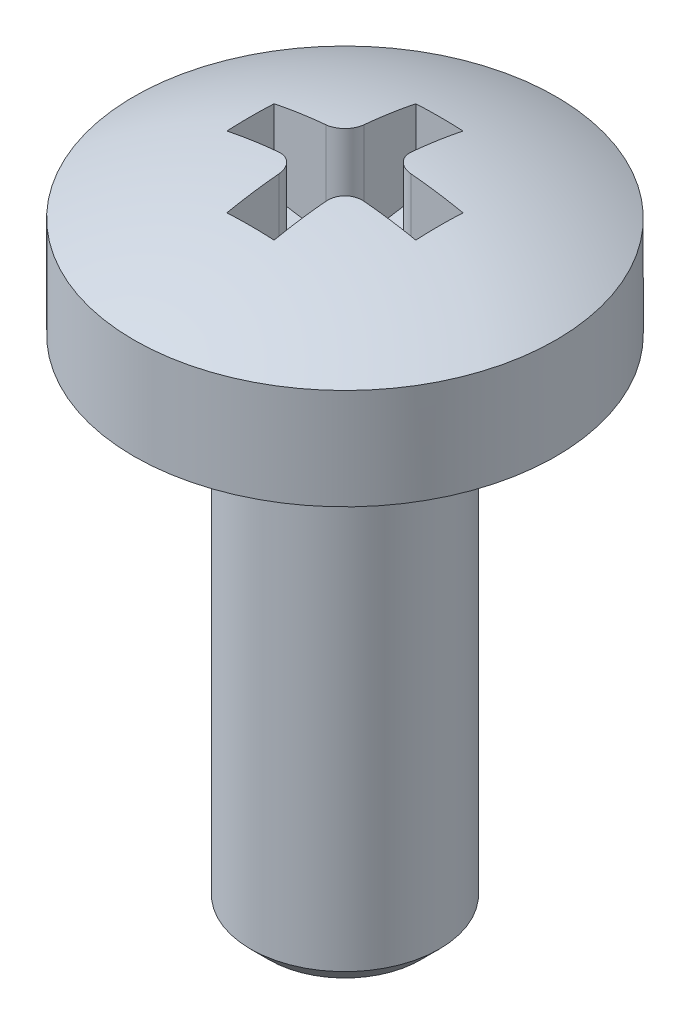
ISO-10303-21;
HEADER;
FILE_DESCRIPTION(('STEP AP214'),'2;1');
FILE_NAME('part.step','',(''),(''),'','','');
FILE_SCHEMA(('AUTOMOTIVE_DESIGN { 1 0 10303 214 1 1 1 1 }'));
ENDSEC;
DATA;
#1=APPLICATION_CONTEXT('core data for automotive mechanical design processes');
#2=APPLICATION_PROTOCOL_DEFINITION('international standard','automotive_design',2000,#1);
#3=PRODUCT_CONTEXT('',#1,'mechanical');
#4=PRODUCT('Part','Part','',(#3));
#5=PRODUCT_RELATED_PRODUCT_CATEGORY('part','',(#4));
#6=PRODUCT_DEFINITION_FORMATION('','',#4);
#7=PRODUCT_DEFINITION_CONTEXT('part definition',#1,'design');
#8=PRODUCT_DEFINITION('design','',#6,#7);
#9=PRODUCT_DEFINITION_SHAPE('','',#8);
#10=(LENGTH_UNIT() NAMED_UNIT(*) SI_UNIT(.MILLI.,.METRE.));
#11=(NAMED_UNIT(*) PLANE_ANGLE_UNIT() SI_UNIT($,.RADIAN.));
#12=(NAMED_UNIT(*) SI_UNIT($,.STERADIAN.) SOLID_ANGLE_UNIT());
#13=UNCERTAINTY_MEASURE_WITH_UNIT(LENGTH_MEASURE(1.E-05),#10,'distance_accuracy_value','');
#14=(GEOMETRIC_REPRESENTATION_CONTEXT(3) GLOBAL_UNCERTAINTY_ASSIGNED_CONTEXT((#13)) GLOBAL_UNIT_ASSIGNED_CONTEXT((#10,
#11,#12)) REPRESENTATION_CONTEXT('',''));
#15=CARTESIAN_POINT('',(0.,0.,0.));
#16=DIRECTION('',(0.,0.,1.));
#17=DIRECTION('',(1.,0.,0.));
#18=AXIS2_PLACEMENT_3D('',#15,#16,#17);
#19=CARTESIAN_POINT('',(0.,-5.01406250000001,0.));
#20=DIRECTION('',(0.,1.,0.));
#21=DIRECTION('',(1.,0.,0.));
#22=AXIS2_PLACEMENT_3D('',#19,#20,#21);
#23=SPHERICAL_SURFACE('',#22,7.41406250000001);
#24=CARTESIAN_POINT('',(0.375,-5.01406250000001,0.));
#25=DIRECTION('',(1.,0.,0.));
#26=DIRECTION('',(0.,0.,-1.));
#27=AXIS2_PLACEMENT_3D('',#24,#25,#26);
#28=CIRCLE('',#27,7.40457275971453);
#29=CARTESIAN_POINT('',(0.375,2.23698554520741,-1.5));
#30=VERTEX_POINT('',#29);
#31=CARTESIAN_POINT('',(0.375,2.35967961333067,-0.675));
#32=VERTEX_POINT('',#31);
#33=EDGE_CURVE('E196',#30,#32,#28,.T.);
#34=ORIENTED_EDGE('',*,*,#33,.T.);
#35=CARTESIAN_POINT('',(0.375,2.35967961333067,-0.675));
#36=CARTESIAN_POINT('',(0.374985448737684,2.36121651162663,-0.658225318985723));
#37=CARTESIAN_POINT('',(0.376406173652611,2.36262244801135,-0.641440863121498));
#38=CARTESIAN_POINT('',(0.382024650443457,2.36513771515628,-0.608329835626822));
#39=CARTESIAN_POINT('',(0.38622085767909,2.36624721041308,-0.592003014573896));
#40=CARTESIAN_POINT('',(0.397300635484306,2.36813732470414,-0.560254470482996));
#41=CARTESIAN_POINT('',(0.404185986366176,2.3689177251522,-0.544833354852065));
#42=CARTESIAN_POINT('',(0.420447745702151,2.37012589432307,-0.51535587131694));
#43=CARTESIAN_POINT('',(0.429823497039336,2.37055375594478,-0.501299144739112));
#44=CARTESIAN_POINT('',(0.45075479909411,2.37104328596649,-0.475012122203495));
#45=CARTESIAN_POINT('',(0.462300294783578,2.37110660254395,-0.462773849871419));
#46=CARTESIAN_POINT('',(0.487272192266538,2.3708695680863,-0.44039530197322));
#47=CARTESIAN_POINT('',(0.500698910491746,2.37056915580496,-0.430255380073096));
#48=CARTESIAN_POINT('',(0.529018787895926,2.36961443868963,-0.412379615394909));
#49=CARTESIAN_POINT('',(0.543909163871989,2.36896079528223,-0.404639321798304));
#50=CARTESIAN_POINT('',(0.574752563793523,2.3673189632613,-0.391751967993709));
#51=CARTESIAN_POINT('',(0.590705099903908,2.36633092738967,-0.386603726468988));
#52=CARTESIAN_POINT('',(0.618117361523144,2.36440750102671,-0.380218792603659));
#53=CARTESIAN_POINT('',(0.629420641493764,2.36355241306441,-0.378262173352228));
#54=CARTESIAN_POINT('',(0.65214973825016,2.36171137165102,-0.375652776766312));
#55=CARTESIAN_POINT('',(0.663575356982319,2.36072560683811,-0.37499814135454));
#56=CARTESIAN_POINT('',(0.675,2.35967961333067,-0.375));
#57=B_SPLINE_CURVE_WITH_KNOTS('',3,(#35,#36,#37,#38,#39,#40,#41,#42,#43,#44,#45,#46,#47,#48,#49,
#50,#51,#52,#53,#54,#55,#56),.UNSPECIFIED.,.F.,.F.,(4,2,2,2,2,2,2,2,2,2,4),(0.,
0.0504714064155058,0.100914747566651,0.15139154083357,0.201855028504468,0.252090180891864,
0.302333793268078,0.352483648650164,0.402610627712908,0.437049311049132,0.471438811145853),.UNSPECIFIED.);
#58=CARTESIAN_POINT('',(0.675,2.35967961333067,-0.375));
#59=VERTEX_POINT('',#58);
#60=EDGE_CURVE('E258',#32,#59,#57,.T.);
#61=ORIENTED_EDGE('',*,*,#60,.T.);
#62=CARTESIAN_POINT('',(0.,-5.01406250000001,-0.375));
#63=DIRECTION('',(0.,0.,-1.));
#64=DIRECTION('',(-1.,0.,0.));
#65=AXIS2_PLACEMENT_3D('',#62,#63,#64);
#66=CIRCLE('',#65,7.40457275971453);
#67=CARTESIAN_POINT('',(1.5,2.23698554520741,-0.375));
#68=VERTEX_POINT('',#67);
#69=EDGE_CURVE('E194',#59,#68,#66,.T.);
#70=ORIENTED_EDGE('',*,*,#69,.T.);
#71=CARTESIAN_POINT('',(1.5,-5.01406250000001,0.));
#72=DIRECTION('',(1.,0.,0.));
#73=DIRECTION('',(0.,0.,-1.));
#74=AXIS2_PLACEMENT_3D('',#71,#72,#73);
#75=CIRCLE('',#74,7.26073844411892);
#76=CARTESIAN_POINT('',(1.5,2.23698554520741,0.375));
#77=VERTEX_POINT('',#76);
#78=EDGE_CURVE('E171',#68,#77,#75,.T.);
#79=ORIENTED_EDGE('',*,*,#78,.T.);
#80=CARTESIAN_POINT('',(0.,-5.01406250000001,0.375));
#81=DIRECTION('',(0.,0.,1.));
#82=DIRECTION('',(1.,0.,0.));
#83=AXIS2_PLACEMENT_3D('',#80,#81,#82);
#84=CIRCLE('',#83,7.40457275971453);
#85=CARTESIAN_POINT('',(0.675,2.35967961333067,0.375));
#86=VERTEX_POINT('',#85);
#87=EDGE_CURVE('E220',#77,#86,#84,.T.);
#88=ORIENTED_EDGE('',*,*,#87,.T.);
#89=CARTESIAN_POINT('',(0.675,2.35967961333067,0.375));
#90=CARTESIAN_POINT('',(0.658225318985723,2.36121651162663,0.374985448737685));
#91=CARTESIAN_POINT('',(0.641440863121498,2.36262244801135,0.376406173652611));
#92=CARTESIAN_POINT('',(0.608329835626822,2.36513771515628,0.382024650443458));
#93=CARTESIAN_POINT('',(0.592003014573896,2.36624721041308,0.38622085767909));
#94=CARTESIAN_POINT('',(0.560254470482996,2.36813732470414,0.397300635484307));
#95=CARTESIAN_POINT('',(0.544833354852065,2.3689177251522,0.404185986366176));
#96=CARTESIAN_POINT('',(0.51535587131694,2.37012589432307,0.420447745702151));
#97=CARTESIAN_POINT('',(0.501299144739112,2.37055375594478,0.429823497039336));
#98=CARTESIAN_POINT('',(0.475012122203495,2.37104328596649,0.450754799094111));
#99=CARTESIAN_POINT('',(0.462773849871419,2.37110660254395,0.462300294783578));
#100=CARTESIAN_POINT('',(0.44039530197322,2.3708695680863,0.487272192266539));
#101=CARTESIAN_POINT('',(0.430255380073096,2.37056915580496,0.500698910491747));
#102=CARTESIAN_POINT('',(0.412379615394909,2.36961443868963,0.529018787895926));
#103=CARTESIAN_POINT('',(0.404639321798304,2.36896079528223,0.54390916387199));
#104=CARTESIAN_POINT('',(0.391751967993709,2.3673189632613,0.574752563793524));
#105=CARTESIAN_POINT('',(0.386603726468988,2.36633092738967,0.590705099903909));
#106=CARTESIAN_POINT('',(0.380218792603659,2.36440750102671,0.618117361523145));
#107=CARTESIAN_POINT('',(0.378262173352228,2.36355241306441,0.629420641493764));
#108=CARTESIAN_POINT('',(0.375652776766312,2.36171137165102,0.65214973825016));
#109=CARTESIAN_POINT('',(0.37499814135454,2.36072560683811,0.663575356982319));
#110=CARTESIAN_POINT('',(0.375,2.35967961333067,0.675));
#111=B_SPLINE_CURVE_WITH_KNOTS('',3,(#89,#90,#91,#92,#93,#94,#95,#96,#97,#98,#99,#100,#101,#102,
#103,#104,#105,#106,#107,#108,#109,#110),.UNSPECIFIED.,.F.,.F.,(4,2,2,2,2,2,2,2,2,2,4),(0.,
0.0504714064155059,0.100914747566651,0.151391540833571,0.201855028504468,0.252090180891864,
0.302333793268078,0.352483648650164,0.402610627712908,0.437049311049132,0.471438811145853),.UNSPECIFIED.);
#112=CARTESIAN_POINT('',(0.375,2.35967961333067,0.675));
#113=VERTEX_POINT('',#112);
#114=EDGE_CURVE('E253',#86,#113,#111,.T.);
#115=ORIENTED_EDGE('',*,*,#114,.T.);
#116=CARTESIAN_POINT('',(0.375,-5.01406250000001,0.));
#117=DIRECTION('',(1.,0.,0.));
#118=DIRECTION('',(0.,0.,-1.));
#119=AXIS2_PLACEMENT_3D('',#116,#117,#118);
#120=CIRCLE('',#119,7.40457275971453);
#121=CARTESIAN_POINT('',(0.375,2.23698554520741,1.5));
#122=VERTEX_POINT('',#121);
#123=EDGE_CURVE('E218',#113,#122,#120,.T.);
#124=ORIENTED_EDGE('',*,*,#123,.T.);
#125=CARTESIAN_POINT('',(0.,-5.01406250000001,1.5));
#126=DIRECTION('',(0.,0.,1.));
#127=DIRECTION('',(1.,0.,0.));
#128=AXIS2_PLACEMENT_3D('',#125,#126,#127);
#129=CIRCLE('',#128,7.26073844411892);
#130=CARTESIAN_POINT('',(-0.375,2.23698554520741,1.5));
#131=VERTEX_POINT('',#130);
#132=EDGE_CURVE('E215',#122,#131,#129,.T.);
#133=ORIENTED_EDGE('',*,*,#132,.T.);
#134=CARTESIAN_POINT('',(-0.375,-5.01406250000001,0.));
#135=DIRECTION('',(-1.,0.,0.));
#136=DIRECTION('',(0.,0.,1.));
#137=AXIS2_PLACEMENT_3D('',#134,#135,#136);
#138=CIRCLE('',#137,7.40457275971453);
#139=CARTESIAN_POINT('',(-0.375,2.35967961333067,0.675));
#140=VERTEX_POINT('',#139);
#141=EDGE_CURVE('E212',#131,#140,#138,.T.);
#142=ORIENTED_EDGE('',*,*,#141,.T.);
#143=CARTESIAN_POINT('',(-0.375,2.35967961333067,0.675));
#144=CARTESIAN_POINT('',(-0.374985448737685,2.36121651162663,0.658225318985723));
#145=CARTESIAN_POINT('',(-0.376406173652611,2.36262244801135,0.641440863121498));
#146=CARTESIAN_POINT('',(-0.382024650443458,2.36513771515628,0.608329835626822));
#147=CARTESIAN_POINT('',(-0.38622085767909,2.36624721041308,0.592003014573897));
#148=CARTESIAN_POINT('',(-0.397300635484307,2.36813732470414,0.560254470482997));
#149=CARTESIAN_POINT('',(-0.404185986366176,2.3689177251522,0.544833354852065));
#150=CARTESIAN_POINT('',(-0.420447745702151,2.37012589432307,0.515355871316941));
#151=CARTESIAN_POINT('',(-0.429823497039336,2.37055375594478,0.501299144739113));
#152=CARTESIAN_POINT('',(-0.450754799094111,2.37104328596649,0.475012122203495));
#153=CARTESIAN_POINT('',(-0.462300294783578,2.37110660254395,0.462773849871419));
#154=CARTESIAN_POINT('',(-0.487272192266539,2.3708695680863,0.44039530197322));
#155=CARTESIAN_POINT('',(-0.500698910491747,2.37056915580496,0.430255380073097));
#156=CARTESIAN_POINT('',(-0.529018787895926,2.36961443868963,0.412379615394909));
#157=CARTESIAN_POINT('',(-0.54390916387199,2.36896079528223,0.404639321798304));
#158=CARTESIAN_POINT('',(-0.574752563793524,2.3673189632613,0.39175196799371));
#159=CARTESIAN_POINT('',(-0.590705099903909,2.36633092738967,0.386603726468988));
#160=CARTESIAN_POINT('',(-0.618117361523144,2.36440750102671,0.38021879260366));
#161=CARTESIAN_POINT('',(-0.629420641493764,2.36355241306441,0.378262173352228));
#162=CARTESIAN_POINT('',(-0.65214973825016,2.36171137165102,0.375652776766313));
#163=CARTESIAN_POINT('',(-0.663575356982319,2.36072560683811,0.374998141354541));
#164=CARTESIAN_POINT('',(-0.675,2.35967961333067,0.375));
#165=B_SPLINE_CURVE_WITH_KNOTS('',3,(#143,#144,#145,#146,#147,#148,#149,#150,#151,#152,#153,
#154,#155,#156,#157,#158,#159,#160,#161,#162,#163,#164),.UNSPECIFIED.,.F.,.F.,(4,2,2,2,2,2,2,2,
2,2,4),(0.,0.0504714064155059,0.100914747566651,0.151391540833571,0.201855028504468,
0.252090180891864,0.302333793268078,0.352483648650164,0.402610627712908,0.437049311049132,
0.471438811145853),.UNSPECIFIED.);
#166=CARTESIAN_POINT('',(-0.675,2.35967961333067,0.375));
#167=VERTEX_POINT('',#166);
#168=EDGE_CURVE('E232',#140,#167,#165,.T.);
#169=ORIENTED_EDGE('',*,*,#168,.T.);
#170=CARTESIAN_POINT('',(0.,-5.01406250000001,0.375));
#171=DIRECTION('',(0.,0.,1.));
#172=DIRECTION('',(1.,0.,0.));
#173=AXIS2_PLACEMENT_3D('',#170,#171,#172);
#174=CIRCLE('',#173,7.40457275971453);
#175=CARTESIAN_POINT('',(-1.5,2.23698554520741,0.375));
#176=VERTEX_POINT('',#175);
#177=EDGE_CURVE('E210',#167,#176,#174,.T.);
#178=ORIENTED_EDGE('',*,*,#177,.T.);
#179=CARTESIAN_POINT('',(-1.5,-5.01406250000001,0.));
#180=DIRECTION('',(-1.,0.,0.));
#181=DIRECTION('',(0.,0.,1.));
#182=AXIS2_PLACEMENT_3D('',#179,#180,#181);
#183=CIRCLE('',#182,7.26073844411892);
#184=CARTESIAN_POINT('',(-1.5,2.23698554520741,-0.375));
#185=VERTEX_POINT('',#184);
#186=EDGE_CURVE('E207',#176,#185,#183,.T.);
#187=ORIENTED_EDGE('',*,*,#186,.T.);
#188=CARTESIAN_POINT('',(0.,-5.01406250000001,-0.375));
#189=DIRECTION('',(0.,0.,-1.));
#190=DIRECTION('',(-1.,0.,0.));
#191=AXIS2_PLACEMENT_3D('',#188,#189,#190);
#192=CIRCLE('',#191,7.40457275971453);
#193=CARTESIAN_POINT('',(-0.675,2.35967961333067,-0.375));
#194=VERTEX_POINT('',#193);
#195=EDGE_CURVE('E204',#185,#194,#192,.T.);
#196=ORIENTED_EDGE('',*,*,#195,.T.);
#197=CARTESIAN_POINT('',(-0.675,2.35967961333067,-0.375));
#198=CARTESIAN_POINT('',(-0.658225318985724,2.36121651162663,-0.374985448737684));
#199=CARTESIAN_POINT('',(-0.641440863121499,2.36262244801135,-0.376406173652611));
#200=CARTESIAN_POINT('',(-0.608329835626822,2.36513771515628,-0.382024650443457));
#201=CARTESIAN_POINT('',(-0.592003014573897,2.36624721041308,-0.38622085767909));
#202=CARTESIAN_POINT('',(-0.560254470482997,2.36813732470414,-0.397300635484306));
#203=CARTESIAN_POINT('',(-0.544833354852065,2.3689177251522,-0.404185986366176));
#204=CARTESIAN_POINT('',(-0.515355871316941,2.37012589432307,-0.420447745702151));
#205=CARTESIAN_POINT('',(-0.501299144739113,2.37055375594478,-0.429823497039336));
#206=CARTESIAN_POINT('',(-0.475012122203495,2.37104328596649,-0.45075479909411));
#207=CARTESIAN_POINT('',(-0.462773849871419,2.37110660254395,-0.462300294783578));
#208=CARTESIAN_POINT('',(-0.44039530197322,2.3708695680863,-0.487272192266538));
#209=CARTESIAN_POINT('',(-0.430255380073097,2.37056915580496,-0.500698910491746));
#210=CARTESIAN_POINT('',(-0.41237961539491,2.36961443868963,-0.529018787895926));
#211=CARTESIAN_POINT('',(-0.404639321798305,2.36896079528223,-0.543909163871989));
#212=CARTESIAN_POINT('',(-0.39175196799371,2.3673189632613,-0.574752563793523));
#213=CARTESIAN_POINT('',(-0.386603726468988,2.36633092738967,-0.590705099903908));
#214=CARTESIAN_POINT('',(-0.38021879260366,2.36440750102671,-0.618117361523144));
#215=CARTESIAN_POINT('',(-0.378262173352229,2.36355241306441,-0.629420641493764));
#216=CARTESIAN_POINT('',(-0.375652776766313,2.36171137165102,-0.65214973825016));
#217=CARTESIAN_POINT('',(-0.374998141354541,2.36072560683811,-0.663575356982319));
#218=CARTESIAN_POINT('',(-0.375,2.35967961333067,-0.675));
#219=B_SPLINE_CURVE_WITH_KNOTS('',3,(#197,#198,#199,#200,#201,#202,#203,#204,#205,#206,#207,
#208,#209,#210,#211,#212,#213,#214,#215,#216,#217,#218),.UNSPECIFIED.,.F.,.F.,(4,2,2,2,2,2,2,2,
2,2,4),(0.,0.0504714064155059,0.100914747566651,0.151391540833571,0.201855028504468,
0.252090180891864,0.302333793268078,0.352483648650164,0.402610627712908,0.437049311049132,
0.471438811145853),.UNSPECIFIED.);
#220=CARTESIAN_POINT('',(-0.375,2.35967961333067,-0.675));
#221=VERTEX_POINT('',#220);
#222=EDGE_CURVE('E226',#194,#221,#219,.T.);
#223=ORIENTED_EDGE('',*,*,#222,.T.);
#224=CARTESIAN_POINT('',(-0.375,-5.01406250000001,0.));
#225=DIRECTION('',(-1.,0.,0.));
#226=DIRECTION('',(0.,0.,1.));
#227=AXIS2_PLACEMENT_3D('',#224,#225,#226);
#228=CIRCLE('',#227,7.40457275971453);
#229=CARTESIAN_POINT('',(-0.375,2.23698554520741,-1.5));
#230=VERTEX_POINT('',#229);
#231=EDGE_CURVE('E202',#221,#230,#228,.T.);
#232=ORIENTED_EDGE('',*,*,#231,.T.);
#233=CARTESIAN_POINT('',(0.,-5.01406250000001,-1.5));
#234=DIRECTION('',(0.,0.,-1.));
#235=DIRECTION('',(-1.,0.,0.));
#236=AXIS2_PLACEMENT_3D('',#233,#234,#235);
#237=CIRCLE('',#236,7.26073844411892);
#238=EDGE_CURVE('E199',#230,#30,#237,.T.);
#239=ORIENTED_EDGE('',*,*,#238,.T.);
#240=EDGE_LOOP('',(#34,#61,#70,#79,#88,#115,#124,#133,#142,#169,#178,#187,#196,#223,#232,#239));
#241=FACE_BOUND('',#240,.T.);
#242=CARTESIAN_POINT('',(0.,1.6,0.));
#243=DIRECTION('',(0.,1.,0.));
#244=DIRECTION('',(0.,0.,1.));
#245=AXIS2_PLACEMENT_3D('',#242,#243,#244);
#246=CIRCLE('',#245,3.35);
#247=CARTESIAN_POINT('',(0.,1.6,3.35));
#248=VERTEX_POINT('',#247);
#249=EDGE_CURVE('E190',#248,#248,#246,.T.);
#250=ORIENTED_EDGE('',*,*,#249,.T.);
#251=EDGE_LOOP('',(#250));
#252=FACE_BOUND('',#251,.T.);
#253=ADVANCED_FACE('F38',(#241,#252),#23,.T.);
#254=CARTESIAN_POINT('',(0.,2.4,0.));
#255=DIRECTION('',(0.,1.,0.));
#256=DIRECTION('',(0.,0.,1.));
#257=AXIS2_PLACEMENT_3D('',#254,#255,#256);
#258=CYLINDRICAL_SURFACE('',#257,3.35);
#259=ORIENTED_EDGE('',*,*,#249,.F.);
#260=EDGE_LOOP('',(#259));
#261=FACE_BOUND('',#260,.T.);
#262=CARTESIAN_POINT('',(0.,0.,0.));
#263=DIRECTION('',(0.,1.,0.));
#264=DIRECTION('',(0.,0.,1.));
#265=AXIS2_PLACEMENT_3D('',#262,#263,#264);
#266=CIRCLE('',#265,3.35);
#267=CARTESIAN_POINT('',(0.,0.,3.35));
#268=VERTEX_POINT('',#267);
#269=EDGE_CURVE('E182',#268,#268,#266,.T.);
#270=ORIENTED_EDGE('',*,*,#269,.T.);
#271=EDGE_LOOP('',(#270));
#272=FACE_BOUND('',#271,.T.);
#273=ADVANCED_FACE('F244',(#261,#272),#258,.T.);
#274=CARTESIAN_POINT('',(3.35,0.,0.));
#275=DIRECTION('',(0.,1.,0.));
#276=DIRECTION('',(0.,0.,1.));
#277=AXIS2_PLACEMENT_3D('',#274,#275,#276);
#278=PLANE('',#277);
#279=CARTESIAN_POINT('',(0.,0.,0.));
#280=DIRECTION('',(0.,1.,0.));
#281=DIRECTION('',(0.,0.,1.));
#282=AXIS2_PLACEMENT_3D('',#279,#280,#281);
#283=CIRCLE('',#282,2.25);
#284=CARTESIAN_POINT('',(0.,0.,2.25));
#285=VERTEX_POINT('',#284);
#286=EDGE_CURVE('E330',#285,#285,#283,.T.);
#287=ORIENTED_EDGE('',*,*,#286,.T.);
#288=EDGE_LOOP('',(#287));
#289=FACE_BOUND('',#288,.T.);
#290=ORIENTED_EDGE('',*,*,#269,.F.);
#291=EDGE_LOOP('',(#290));
#292=FACE_BOUND('',#291,.T.);
#293=ADVANCED_FACE('F408',(#289,#292),#278,.F.);
#294=CARTESIAN_POINT('',(0.375,-8.001,0.375));
#295=DIRECTION('',(0.,0.,1.));
#296=DIRECTION('',(1.,0.,0.));
#297=AXIS2_PLACEMENT_3D('',#294,#295,#296);
#298=PLANE('',#297);
#299=CARTESIAN_POINT('',(0.,8.21406250000002,0.375));
#300=DIRECTION('',(0.,0.,1.));
#301=DIRECTION('',(1.,0.,0.));
#302=AXIS2_PLACEMENT_3D('',#299,#300,#301);
#303=CIRCLE('',#302,7.40457275971454);
#304=CARTESIAN_POINT('',(1.5,0.963014454792585,0.375));
#305=VERTEX_POINT('',#304);
#306=CARTESIAN_POINT('',(0.675,0.84032038666933,0.375));
#307=VERTEX_POINT('',#306);
#308=EDGE_CURVE('E177',#305,#307,#303,.F.);
#309=ORIENTED_EDGE('',*,*,#308,.T.);
#310=DIRECTION('',(0.,1.,0.));
#311=VECTOR('',#310,1.);
#312=CARTESIAN_POINT('',(0.675,-8.001,0.375));
#313=LINE('',#312,#311);
#314=EDGE_CURVE('E389',#307,#86,#313,.T.);
#315=ORIENTED_EDGE('',*,*,#314,.T.);
#316=ORIENTED_EDGE('',*,*,#87,.F.);
#317=DIRECTION('',(0.,1.,0.));
#318=VECTOR('',#317,1.);
#319=CARTESIAN_POINT('',(1.5,-8.001,0.375));
#320=LINE('',#319,#318);
#321=EDGE_CURVE('E173',#305,#77,#320,.T.);
#322=ORIENTED_EDGE('',*,*,#321,.F.);
#323=EDGE_LOOP('',(#309,#315,#316,#322));
#324=FACE_BOUND('',#323,.T.);
#325=ADVANCED_FACE('F406',(#324),#298,.F.);
#326=CARTESIAN_POINT('',(0.375,-8.001,0.375));
#327=DIRECTION('',(1.,0.,0.));
#328=DIRECTION('',(0.,0.,-1.));
#329=AXIS2_PLACEMENT_3D('',#326,#327,#328);
#330=PLANE('',#329);
#331=ORIENTED_EDGE('',*,*,#123,.F.);
#332=DIRECTION('',(0.,1.,0.));
#333=VECTOR('',#332,1.);
#334=CARTESIAN_POINT('',(0.375,-8.001,0.675));
#335=LINE('',#334,#333);
#336=CARTESIAN_POINT('',(0.375,0.84032038666933,0.675));
#337=VERTEX_POINT('',#336);
#338=EDGE_CURVE('E387',#113,#337,#335,.F.);
#339=ORIENTED_EDGE('',*,*,#338,.T.);
#340=CARTESIAN_POINT('',(0.375,8.21406250000002,0.));
#341=DIRECTION('',(1.,0.,0.));
#342=DIRECTION('',(0.,0.,-1.));
#343=AXIS2_PLACEMENT_3D('',#340,#341,#342);
#344=CIRCLE('',#343,7.40457275971454);
#345=CARTESIAN_POINT('',(0.375,0.963014454792585,1.5));
#346=VERTEX_POINT('',#345);
#347=EDGE_CURVE('E184',#337,#346,#344,.F.);
#348=ORIENTED_EDGE('',*,*,#347,.T.);
#349=DIRECTION('',(0.,1.,0.));
#350=VECTOR('',#349,1.);
#351=CARTESIAN_POINT('',(0.375,-8.001,1.5));
#352=LINE('',#351,#350);
#353=EDGE_CURVE('E163',#346,#122,#352,.T.);
#354=ORIENTED_EDGE('',*,*,#353,.T.);
#355=EDGE_LOOP('',(#331,#339,#348,#354));
#356=FACE_BOUND('',#355,.T.);
#357=ADVANCED_FACE('F295',(#356),#330,.F.);
#358=CARTESIAN_POINT('',(-0.375,-8.001,1.5));
#359=DIRECTION('',(0.,0.,1.));
#360=DIRECTION('',(1.,0.,0.));
#361=AXIS2_PLACEMENT_3D('',#358,#359,#360);
#362=PLANE('',#361);
#363=ORIENTED_EDGE('',*,*,#353,.F.);
#364=CARTESIAN_POINT('',(0.,8.21406250000002,1.5));
#365=DIRECTION('',(0.,0.,1.));
#366=DIRECTION('',(1.,0.,0.));
#367=AXIS2_PLACEMENT_3D('',#364,#365,#366);
#368=CIRCLE('',#367,7.26073844411893);
#369=CARTESIAN_POINT('',(-0.375,0.963014454792586,1.5));
#370=VERTEX_POINT('',#369);
#371=EDGE_CURVE('E349',#346,#370,#368,.F.);
#372=ORIENTED_EDGE('',*,*,#371,.T.);
#373=DIRECTION('',(0.,1.,0.));
#374=VECTOR('',#373,1.);
#375=CARTESIAN_POINT('',(-0.375,-8.001,1.5));
#376=LINE('',#375,#374);
#377=EDGE_CURVE('E354',#370,#131,#376,.T.);
#378=ORIENTED_EDGE('',*,*,#377,.T.);
#379=ORIENTED_EDGE('',*,*,#132,.F.);
#380=EDGE_LOOP('',(#363,#372,#378,#379));
#381=FACE_BOUND('',#380,.T.);
#382=ADVANCED_FACE('F447',(#381),#362,.F.);
#383=CARTESIAN_POINT('',(-0.375,-8.001,0.375));
#384=DIRECTION('',(-1.,0.,0.));
#385=DIRECTION('',(0.,0.,1.));
#386=AXIS2_PLACEMENT_3D('',#383,#384,#385);
#387=PLANE('',#386);
#388=CARTESIAN_POINT('',(-0.375,8.21406250000002,0.));
#389=DIRECTION('',(-1.,0.,0.));
#390=DIRECTION('',(0.,0.,1.));
#391=AXIS2_PLACEMENT_3D('',#388,#389,#390);
#392=CIRCLE('',#391,7.40457275971454);
#393=CARTESIAN_POINT('',(-0.375,0.84032038666933,0.675));
#394=VERTEX_POINT('',#393);
#395=EDGE_CURVE('E346',#370,#394,#392,.F.);
#396=ORIENTED_EDGE('',*,*,#395,.T.);
#397=DIRECTION('',(0.,1.,0.));
#398=VECTOR('',#397,1.);
#399=CARTESIAN_POINT('',(-0.375,-8.001,0.675));
#400=LINE('',#399,#398);
#401=EDGE_CURVE('E384',#394,#140,#400,.T.);
#402=ORIENTED_EDGE('',*,*,#401,.T.);
#403=ORIENTED_EDGE('',*,*,#141,.F.);
#404=ORIENTED_EDGE('',*,*,#377,.F.);
#405=EDGE_LOOP('',(#396,#402,#403,#404));
#406=FACE_BOUND('',#405,.T.);
#407=ADVANCED_FACE('F454',(#406),#387,.F.);
#408=CARTESIAN_POINT('',(-1.5,-8.001,0.375));
#409=DIRECTION('',(0.,0.,1.));
#410=DIRECTION('',(1.,0.,0.));
#411=AXIS2_PLACEMENT_3D('',#408,#409,#410);
#412=PLANE('',#411);
#413=ORIENTED_EDGE('',*,*,#177,.F.);
#414=DIRECTION('',(0.,1.,0.));
#415=VECTOR('',#414,1.);
#416=CARTESIAN_POINT('',(-0.675,-8.001,0.375));
#417=LINE('',#416,#415);
#418=CARTESIAN_POINT('',(-0.675,0.84032038666933,0.375));
#419=VERTEX_POINT('',#418);
#420=EDGE_CURVE('E380',#167,#419,#417,.F.);
#421=ORIENTED_EDGE('',*,*,#420,.T.);
#422=CARTESIAN_POINT('',(0.,8.21406250000002,0.375));
#423=DIRECTION('',(0.,0.,1.));
#424=DIRECTION('',(1.,0.,0.));
#425=AXIS2_PLACEMENT_3D('',#422,#423,#424);
#426=CIRCLE('',#425,7.40457275971454);
#427=CARTESIAN_POINT('',(-1.5,0.963014454792585,0.375));
#428=VERTEX_POINT('',#427);
#429=EDGE_CURVE('E344',#419,#428,#426,.F.);
#430=ORIENTED_EDGE('',*,*,#429,.T.);
#431=DIRECTION('',(0.,1.,0.));
#432=VECTOR('',#431,1.);
#433=CARTESIAN_POINT('',(-1.5,-8.001,0.375));
#434=LINE('',#433,#432);
#435=EDGE_CURVE('E357',#428,#176,#434,.T.);
#436=ORIENTED_EDGE('',*,*,#435,.T.);
#437=EDGE_LOOP('',(#413,#421,#430,#436));
#438=FACE_BOUND('',#437,.T.);
#439=ADVANCED_FACE('F459',(#438),#412,.F.);
#440=CARTESIAN_POINT('',(-1.5,-8.001,-0.375));
#441=DIRECTION('',(-1.,0.,0.));
#442=DIRECTION('',(0.,0.,1.));
#443=AXIS2_PLACEMENT_3D('',#440,#441,#442);
#444=PLANE('',#443);
#445=ORIENTED_EDGE('',*,*,#435,.F.);
#446=CARTESIAN_POINT('',(-1.5,8.21406250000002,0.));
#447=DIRECTION('',(-1.,0.,0.));
#448=DIRECTION('',(0.,0.,1.));
#449=AXIS2_PLACEMENT_3D('',#446,#447,#448);
#450=CIRCLE('',#449,7.26073844411893);
#451=CARTESIAN_POINT('',(-1.5,0.963014454792586,-0.375));
#452=VERTEX_POINT('',#451);
#453=EDGE_CURVE('E342',#428,#452,#450,.F.);
#454=ORIENTED_EDGE('',*,*,#453,.T.);
#455=DIRECTION('',(0.,1.,0.));
#456=VECTOR('',#455,1.);
#457=CARTESIAN_POINT('',(-1.5,-8.001,-0.375));
#458=LINE('',#457,#456);
#459=EDGE_CURVE('E360',#452,#185,#458,.T.);
#460=ORIENTED_EDGE('',*,*,#459,.T.);
#461=ORIENTED_EDGE('',*,*,#186,.F.);
#462=EDGE_LOOP('',(#445,#454,#460,#461));
#463=FACE_BOUND('',#462,.T.);
#464=ADVANCED_FACE('F469',(#463),#444,.F.);
#465=CARTESIAN_POINT('',(-1.5,-8.001,-0.375));
#466=DIRECTION('',(0.,0.,-1.));
#467=DIRECTION('',(-1.,0.,0.));
#468=AXIS2_PLACEMENT_3D('',#465,#466,#467);
#469=PLANE('',#468);
#470=CARTESIAN_POINT('',(0.,8.21406250000002,-0.375));
#471=DIRECTION('',(0.,0.,-1.));
#472=DIRECTION('',(-1.,0.,0.));
#473=AXIS2_PLACEMENT_3D('',#470,#471,#472);
#474=CIRCLE('',#473,7.40457275971454);
#475=CARTESIAN_POINT('',(-0.675,0.84032038666933,-0.375));
#476=VERTEX_POINT('',#475);
#477=EDGE_CURVE('E340',#452,#476,#474,.F.);
#478=ORIENTED_EDGE('',*,*,#477,.T.);
#479=DIRECTION('',(0.,1.,0.));
#480=VECTOR('',#479,1.);
#481=CARTESIAN_POINT('',(-0.675,-8.001,-0.375));
#482=LINE('',#481,#480);
#483=EDGE_CURVE('E379',#476,#194,#482,.T.);
#484=ORIENTED_EDGE('',*,*,#483,.T.);
#485=ORIENTED_EDGE('',*,*,#195,.F.);
#486=ORIENTED_EDGE('',*,*,#459,.F.);
#487=EDGE_LOOP('',(#478,#484,#485,#486));
#488=FACE_BOUND('',#487,.T.);
#489=ADVANCED_FACE('F477',(#488),#469,.F.);
#490=CARTESIAN_POINT('',(-0.375,-8.001,-1.5));
#491=DIRECTION('',(-1.,0.,0.));
#492=DIRECTION('',(0.,0.,1.));
#493=AXIS2_PLACEMENT_3D('',#490,#491,#492);
#494=PLANE('',#493);
#495=ORIENTED_EDGE('',*,*,#231,.F.);
#496=DIRECTION('',(0.,1.,0.));
#497=VECTOR('',#496,1.);
#498=CARTESIAN_POINT('',(-0.375,-8.001,-0.675));
#499=LINE('',#498,#497);
#500=CARTESIAN_POINT('',(-0.375,0.84032038666933,-0.675));
#501=VERTEX_POINT('',#500);
#502=EDGE_CURVE('E53',#221,#501,#499,.F.);
#503=ORIENTED_EDGE('',*,*,#502,.T.);
#504=CARTESIAN_POINT('',(-0.375,8.21406250000002,0.));
#505=DIRECTION('',(-1.,0.,0.));
#506=DIRECTION('',(0.,0.,1.));
#507=AXIS2_PLACEMENT_3D('',#504,#505,#506);
#508=CIRCLE('',#507,7.40457275971454);
#509=CARTESIAN_POINT('',(-0.375,0.963014454792585,-1.5));
#510=VERTEX_POINT('',#509);
#511=EDGE_CURVE('E338',#501,#510,#508,.F.);
#512=ORIENTED_EDGE('',*,*,#511,.T.);
#513=DIRECTION('',(0.,1.,0.));
#514=VECTOR('',#513,1.);
#515=CARTESIAN_POINT('',(-0.375,-8.001,-1.5));
#516=LINE('',#515,#514);
#517=EDGE_CURVE('E363',#510,#230,#516,.T.);
#518=ORIENTED_EDGE('',*,*,#517,.T.);
#519=EDGE_LOOP('',(#495,#503,#512,#518));
#520=FACE_BOUND('',#519,.T.);
#521=ADVANCED_FACE('F376',(#520),#494,.F.);
#522=CARTESIAN_POINT('',(-0.375,-8.001,-1.5));
#523=DIRECTION('',(0.,0.,-1.));
#524=DIRECTION('',(-1.,0.,0.));
#525=AXIS2_PLACEMENT_3D('',#522,#523,#524);
#526=PLANE('',#525);
#527=ORIENTED_EDGE('',*,*,#517,.F.);
#528=CARTESIAN_POINT('',(0.,8.21406250000002,-1.5));
#529=DIRECTION('',(0.,0.,-1.));
#530=DIRECTION('',(-1.,0.,0.));
#531=AXIS2_PLACEMENT_3D('',#528,#529,#530);
#532=CIRCLE('',#531,7.26073844411893);
#533=CARTESIAN_POINT('',(0.375,0.963014454792586,-1.5));
#534=VERTEX_POINT('',#533);
#535=EDGE_CURVE('E336',#510,#534,#532,.F.);
#536=ORIENTED_EDGE('',*,*,#535,.T.);
#537=DIRECTION('',(0.,1.,0.));
#538=VECTOR('',#537,1.);
#539=CARTESIAN_POINT('',(0.375,-8.001,-1.5));
#540=LINE('',#539,#538);
#541=EDGE_CURVE('E172',#534,#30,#540,.T.);
#542=ORIENTED_EDGE('',*,*,#541,.T.);
#543=ORIENTED_EDGE('',*,*,#238,.F.);
#544=EDGE_LOOP('',(#527,#536,#542,#543));
#545=FACE_BOUND('',#544,.T.);
#546=ADVANCED_FACE('F371',(#545),#526,.F.);
#547=CARTESIAN_POINT('',(0.375,-8.001,-1.5));
#548=DIRECTION('',(1.,0.,0.));
#549=DIRECTION('',(0.,0.,-1.));
#550=AXIS2_PLACEMENT_3D('',#547,#548,#549);
#551=PLANE('',#550);
#552=CARTESIAN_POINT('',(0.375,8.21406250000002,0.));
#553=DIRECTION('',(1.,0.,0.));
#554=DIRECTION('',(0.,0.,-1.));
#555=AXIS2_PLACEMENT_3D('',#552,#553,#554);
#556=CIRCLE('',#555,7.40457275971454);
#557=CARTESIAN_POINT('',(0.375,0.84032038666933,-0.675));
#558=VERTEX_POINT('',#557);
#559=EDGE_CURVE('E162',#534,#558,#556,.F.);
#560=ORIENTED_EDGE('',*,*,#559,.T.);
#561=DIRECTION('',(0.,1.,0.));
#562=VECTOR('',#561,1.);
#563=CARTESIAN_POINT('',(0.375,-8.001,-0.675));
#564=LINE('',#563,#562);
#565=EDGE_CURVE('E223',#558,#32,#564,.T.);
#566=ORIENTED_EDGE('',*,*,#565,.T.);
#567=ORIENTED_EDGE('',*,*,#33,.F.);
#568=ORIENTED_EDGE('',*,*,#541,.F.);
#569=EDGE_LOOP('',(#560,#566,#567,#568));
#570=FACE_BOUND('',#569,.T.);
#571=ADVANCED_FACE('F393',(#570),#551,.F.);
#572=CARTESIAN_POINT('',(0.375,-8.001,-0.375));
#573=DIRECTION('',(0.,0.,-1.));
#574=DIRECTION('',(-1.,0.,0.));
#575=AXIS2_PLACEMENT_3D('',#572,#573,#574);
#576=PLANE('',#575);
#577=ORIENTED_EDGE('',*,*,#69,.F.);
#578=DIRECTION('',(0.,1.,0.));
#579=VECTOR('',#578,1.);
#580=CARTESIAN_POINT('',(0.675,-8.001,-0.375));
#581=LINE('',#580,#579);
#582=CARTESIAN_POINT('',(0.675,0.84032038666933,-0.375));
#583=VERTEX_POINT('',#582);
#584=EDGE_CURVE('E159',#59,#583,#581,.F.);
#585=ORIENTED_EDGE('',*,*,#584,.T.);
#586=CARTESIAN_POINT('',(0.,8.21406250000002,-0.375));
#587=DIRECTION('',(0.,0.,-1.));
#588=DIRECTION('',(-1.,0.,0.));
#589=AXIS2_PLACEMENT_3D('',#586,#587,#588);
#590=CIRCLE('',#589,7.40457275971454);
#591=CARTESIAN_POINT('',(1.5,0.963014454792585,-0.375));
#592=VERTEX_POINT('',#591);
#593=EDGE_CURVE('E153',#583,#592,#590,.F.);
#594=ORIENTED_EDGE('',*,*,#593,.T.);
#595=DIRECTION('',(0.,1.,0.));
#596=VECTOR('',#595,1.);
#597=CARTESIAN_POINT('',(1.5,-8.001,-0.375));
#598=LINE('',#597,#596);
#599=EDGE_CURVE('E157',#592,#68,#598,.T.);
#600=ORIENTED_EDGE('',*,*,#599,.T.);
#601=EDGE_LOOP('',(#577,#585,#594,#600));
#602=FACE_BOUND('',#601,.T.);
#603=ADVANCED_FACE('F156',(#602),#576,.F.);
#604=CARTESIAN_POINT('',(1.5,-8.001,-0.375));
#605=DIRECTION('',(1.,0.,0.));
#606=DIRECTION('',(0.,0.,-1.));
#607=AXIS2_PLACEMENT_3D('',#604,#605,#606);
#608=PLANE('',#607);
#609=ORIENTED_EDGE('',*,*,#599,.F.);
#610=CARTESIAN_POINT('',(1.5,8.21406250000002,0.));
#611=DIRECTION('',(1.,0.,0.));
#612=DIRECTION('',(0.,0.,-1.));
#613=AXIS2_PLACEMENT_3D('',#610,#611,#612);
#614=CIRCLE('',#613,7.26073844411893);
#615=EDGE_CURVE('E168',#592,#305,#614,.F.);
#616=ORIENTED_EDGE('',*,*,#615,.T.);
#617=ORIENTED_EDGE('',*,*,#321,.T.);
#618=ORIENTED_EDGE('',*,*,#78,.F.);
#619=EDGE_LOOP('',(#609,#616,#617,#618));
#620=FACE_BOUND('',#619,.T.);
#621=ADVANCED_FACE('F167',(#620),#608,.F.);
#622=CARTESIAN_POINT('',(0.,8.21406250000002,0.));
#623=DIRECTION('',(0.,1.,0.));
#624=DIRECTION('',(1.,0.,0.));
#625=AXIS2_PLACEMENT_3D('',#622,#623,#624);
#626=SPHERICAL_SURFACE('',#625,7.41406250000002);
#627=ORIENTED_EDGE('',*,*,#308,.F.);
#628=ORIENTED_EDGE('',*,*,#615,.F.);
#629=ORIENTED_EDGE('',*,*,#593,.F.);
#630=CARTESIAN_POINT('',(0.675,0.84032038666933,-0.375));
#631=CARTESIAN_POINT('',(0.658225318985723,0.83878348837337,-0.374985448737684));
#632=CARTESIAN_POINT('',(0.641440863121498,0.837377551988649,-0.376406173652611));
#633=CARTESIAN_POINT('',(0.608329835626822,0.834862284843717,-0.382024650443457));
#634=CARTESIAN_POINT('',(0.592003014573896,0.833752789586919,-0.38622085767909));
#635=CARTESIAN_POINT('',(0.560254470482996,0.831862675295854,-0.397300635484306));
#636=CARTESIAN_POINT('',(0.544833354852065,0.831082274847797,-0.404185986366176));
#637=CARTESIAN_POINT('',(0.51535587131694,0.829874105676924,-0.420447745702151));
#638=CARTESIAN_POINT('',(0.501299144739112,0.829446244055217,-0.429823497039336));
#639=CARTESIAN_POINT('',(0.475012122203495,0.828956714033506,-0.45075479909411));
#640=CARTESIAN_POINT('',(0.462773849871419,0.828893397456053,-0.462300294783578));
#641=CARTESIAN_POINT('',(0.44039530197322,0.829130431913701,-0.487272192266538));
#642=CARTESIAN_POINT('',(0.430255380073096,0.829430844195042,-0.500698910491746));
#643=CARTESIAN_POINT('',(0.412379615394909,0.830385561310364,-0.529018787895926));
#644=CARTESIAN_POINT('',(0.404639321798304,0.831039204717767,-0.543909163871989));
#645=CARTESIAN_POINT('',(0.391751967993709,0.832681036738697,-0.574752563793523));
#646=CARTESIAN_POINT('',(0.386603726468988,0.83366907261033,-0.590705099903908));
#647=CARTESIAN_POINT('',(0.380218792603659,0.83559249897329,-0.618117361523144));
#648=CARTESIAN_POINT('',(0.378262173352228,0.836447586935589,-0.629420641493764));
#649=CARTESIAN_POINT('',(0.375652776766312,0.838288628348976,-0.65214973825016));
#650=CARTESIAN_POINT('',(0.37499814135454,0.839274393161886,-0.663575356982319));
#651=CARTESIAN_POINT('',(0.375,0.84032038666933,-0.675));
#652=B_SPLINE_CURVE_WITH_KNOTS('',3,(#630,#631,#632,#633,#634,#635,#636,#637,#638,#639,#640,
#641,#642,#643,#644,#645,#646,#647,#648,#649,#650,#651),.UNSPECIFIED.,.F.,.F.,(4,2,2,2,2,2,2,2,
2,2,4),(0.,0.0504714064155058,0.100914747566651,0.15139154083357,0.201855028504468,
0.252090180891864,0.302333793268078,0.352483648650164,0.402610627712908,0.437049311049132,
0.471438811145853),.UNSPECIFIED.);
#653=EDGE_CURVE('E281',#583,#558,#652,.T.);
#654=ORIENTED_EDGE('',*,*,#653,.T.);
#655=ORIENTED_EDGE('',*,*,#559,.F.);
#656=ORIENTED_EDGE('',*,*,#535,.F.);
#657=ORIENTED_EDGE('',*,*,#511,.F.);
#658=CARTESIAN_POINT('',(-0.375,0.84032038666933,-0.675));
#659=CARTESIAN_POINT('',(-0.374985448737685,0.838783488373371,-0.658225318985723));
#660=CARTESIAN_POINT('',(-0.376406173652612,0.83737755198865,-0.641440863121498));
#661=CARTESIAN_POINT('',(-0.382024650443458,0.834862284843718,-0.608329835626822));
#662=CARTESIAN_POINT('',(-0.38622085767909,0.833752789586919,-0.592003014573896));
#663=CARTESIAN_POINT('',(-0.397300635484307,0.831862675295854,-0.560254470482996));
#664=CARTESIAN_POINT('',(-0.404185986366176,0.831082274847797,-0.544833354852065));
#665=CARTESIAN_POINT('',(-0.420447745702151,0.829874105676924,-0.51535587131694));
#666=CARTESIAN_POINT('',(-0.429823497039336,0.829446244055217,-0.501299144739112));
#667=CARTESIAN_POINT('',(-0.450754799094111,0.828956714033506,-0.475012122203495));
#668=CARTESIAN_POINT('',(-0.462300294783578,0.828893397456053,-0.462773849871419));
#669=CARTESIAN_POINT('',(-0.487272192266539,0.829130431913701,-0.44039530197322));
#670=CARTESIAN_POINT('',(-0.500698910491747,0.829430844195042,-0.430255380073096));
#671=CARTESIAN_POINT('',(-0.529018787895926,0.830385561310364,-0.412379615394909));
#672=CARTESIAN_POINT('',(-0.54390916387199,0.831039204717767,-0.404639321798304));
#673=CARTESIAN_POINT('',(-0.574752563793524,0.832681036738697,-0.391751967993709));
#674=CARTESIAN_POINT('',(-0.590705099903909,0.83366907261033,-0.386603726468988));
#675=CARTESIAN_POINT('',(-0.618117361523145,0.83559249897329,-0.380218792603659));
#676=CARTESIAN_POINT('',(-0.629420641493764,0.836447586935589,-0.378262173352228));
#677=CARTESIAN_POINT('',(-0.65214973825016,0.838288628348977,-0.375652776766312));
#678=CARTESIAN_POINT('',(-0.663575356982319,0.839274393161886,-0.37499814135454));
#679=CARTESIAN_POINT('',(-0.675,0.84032038666933,-0.375));
#680=B_SPLINE_CURVE_WITH_KNOTS('',3,(#658,#659,#660,#661,#662,#663,#664,#665,#666,#667,#668,
#669,#670,#671,#672,#673,#674,#675,#676,#677,#678,#679),.UNSPECIFIED.,.F.,.F.,(4,2,2,2,2,2,2,2,
2,2,4),(0.,0.0504714064155057,0.100914747566651,0.15139154083357,0.201855028504468,
0.252090180891864,0.302333793268078,0.352483648650164,0.402610627712908,0.437049311049132,
0.471438811145853),.UNSPECIFIED.);
#681=EDGE_CURVE('E60',#501,#476,#680,.T.);
#682=ORIENTED_EDGE('',*,*,#681,.T.);
#683=ORIENTED_EDGE('',*,*,#477,.F.);
#684=ORIENTED_EDGE('',*,*,#453,.F.);
#685=ORIENTED_EDGE('',*,*,#429,.F.);
#686=CARTESIAN_POINT('',(-0.675,0.84032038666933,0.375));
#687=CARTESIAN_POINT('',(-0.658225318985723,0.83878348837337,0.374985448737685));
#688=CARTESIAN_POINT('',(-0.641440863121498,0.837377551988649,0.376406173652611));
#689=CARTESIAN_POINT('',(-0.608329835626822,0.834862284843717,0.382024650443458));
#690=CARTESIAN_POINT('',(-0.592003014573897,0.833752789586919,0.38622085767909));
#691=CARTESIAN_POINT('',(-0.560254470482997,0.831862675295854,0.397300635484307));
#692=CARTESIAN_POINT('',(-0.544833354852065,0.831082274847797,0.404185986366176));
#693=CARTESIAN_POINT('',(-0.515355871316941,0.829874105676924,0.420447745702151));
#694=CARTESIAN_POINT('',(-0.501299144739113,0.829446244055217,0.429823497039336));
#695=CARTESIAN_POINT('',(-0.475012122203495,0.828956714033506,0.45075479909411));
#696=CARTESIAN_POINT('',(-0.462773849871419,0.828893397456053,0.462300294783578));
#697=CARTESIAN_POINT('',(-0.44039530197322,0.829130431913701,0.487272192266539));
#698=CARTESIAN_POINT('',(-0.430255380073097,0.829430844195042,0.500698910491746));
#699=CARTESIAN_POINT('',(-0.41237961539491,0.830385561310364,0.529018787895926));
#700=CARTESIAN_POINT('',(-0.404639321798305,0.831039204717767,0.54390916387199));
#701=CARTESIAN_POINT('',(-0.39175196799371,0.832681036738697,0.574752563793524));
#702=CARTESIAN_POINT('',(-0.386603726468988,0.83366907261033,0.590705099903908));
#703=CARTESIAN_POINT('',(-0.38021879260366,0.83559249897329,0.618117361523144));
#704=CARTESIAN_POINT('',(-0.378262173352228,0.836447586935589,0.629420641493764));
#705=CARTESIAN_POINT('',(-0.375652776766313,0.838288628348977,0.65214973825016));
#706=CARTESIAN_POINT('',(-0.374998141354541,0.839274393161886,0.663575356982319));
#707=CARTESIAN_POINT('',(-0.375,0.84032038666933,0.675));
#708=B_SPLINE_CURVE_WITH_KNOTS('',3,(#686,#687,#688,#689,#690,#691,#692,#693,#694,#695,#696,
#697,#698,#699,#700,#701,#702,#703,#704,#705,#706,#707),.UNSPECIFIED.,.F.,.F.,(4,2,2,2,2,2,2,2,
2,2,4),(0.,0.0504714064155059,0.100914747566651,0.15139154083357,0.201855028504468,
0.252090180891864,0.302333793268078,0.352483648650164,0.402610627712908,0.437049311049132,
0.471438811145853),.UNSPECIFIED.);
#709=EDGE_CURVE('E280',#419,#394,#708,.T.);
#710=ORIENTED_EDGE('',*,*,#709,.T.);
#711=ORIENTED_EDGE('',*,*,#395,.F.);
#712=ORIENTED_EDGE('',*,*,#371,.F.);
#713=ORIENTED_EDGE('',*,*,#347,.F.);
#714=CARTESIAN_POINT('',(0.375,0.84032038666933,0.675));
#715=CARTESIAN_POINT('',(0.374985448737684,0.83878348837337,0.658225318985723));
#716=CARTESIAN_POINT('',(0.376406173652611,0.837377551988649,0.641440863121498));
#717=CARTESIAN_POINT('',(0.382024650443457,0.834862284843717,0.608329835626822));
#718=CARTESIAN_POINT('',(0.38622085767909,0.833752789586919,0.592003014573897));
#719=CARTESIAN_POINT('',(0.397300635484306,0.831862675295854,0.560254470482997));
#720=CARTESIAN_POINT('',(0.404185986366176,0.831082274847797,0.544833354852065));
#721=CARTESIAN_POINT('',(0.420447745702151,0.829874105676924,0.515355871316941));
#722=CARTESIAN_POINT('',(0.429823497039336,0.829446244055217,0.501299144739113));
#723=CARTESIAN_POINT('',(0.45075479909411,0.828956714033506,0.475012122203495));
#724=CARTESIAN_POINT('',(0.462300294783578,0.828893397456053,0.462773849871419));
#725=CARTESIAN_POINT('',(0.487272192266538,0.829130431913701,0.44039530197322));
#726=CARTESIAN_POINT('',(0.500698910491746,0.829430844195042,0.430255380073097));
#727=CARTESIAN_POINT('',(0.529018787895926,0.830385561310364,0.412379615394909));
#728=CARTESIAN_POINT('',(0.543909163871989,0.831039204717767,0.404639321798305));
#729=CARTESIAN_POINT('',(0.574752563793523,0.832681036738697,0.39175196799371));
#730=CARTESIAN_POINT('',(0.590705099903908,0.83366907261033,0.386603726468988));
#731=CARTESIAN_POINT('',(0.618117361523144,0.83559249897329,0.38021879260366));
#732=CARTESIAN_POINT('',(0.629420641493764,0.836447586935589,0.378262173352228));
#733=CARTESIAN_POINT('',(0.65214973825016,0.838288628348977,0.375652776766313));
#734=CARTESIAN_POINT('',(0.663575356982319,0.839274393161886,0.374998141354541));
#735=CARTESIAN_POINT('',(0.675,0.84032038666933,0.375));
#736=B_SPLINE_CURVE_WITH_KNOTS('',3,(#714,#715,#716,#717,#718,#719,#720,#721,#722,#723,#724,
#725,#726,#727,#728,#729,#730,#731,#732,#733,#734,#735),.UNSPECIFIED.,.F.,.F.,(4,2,2,2,2,2,2,2,
2,2,4),(0.,0.0504714064155058,0.100914747566651,0.15139154083357,0.201855028504468,
0.252090180891864,0.302333793268078,0.352483648650164,0.402610627712908,0.437049311049132,
0.471438811145853),.UNSPECIFIED.);
#737=EDGE_CURVE('E273',#337,#307,#736,.T.);
#738=ORIENTED_EDGE('',*,*,#737,.T.);
#739=EDGE_LOOP('',(#627,#628,#629,#654,#655,#656,#657,#682,#683,#684,#685,#710,#711,#712,#713,#738));
#740=FACE_BOUND('',#739,.T.);
#741=ADVANCED_FACE('F175',(#740),#626,.F.);
#742=CARTESIAN_POINT('',(0.675,-8.001,-0.675));
#743=DIRECTION('',(0.,1.,0.));
#744=DIRECTION('',(0.,0.,1.));
#745=AXIS2_PLACEMENT_3D('',#742,#743,#744);
#746=CYLINDRICAL_SURFACE('',#745,0.3);
#747=ORIENTED_EDGE('',*,*,#653,.F.);
#748=ORIENTED_EDGE('',*,*,#584,.F.);
#749=ORIENTED_EDGE('',*,*,#60,.F.);
#750=ORIENTED_EDGE('',*,*,#565,.F.);
#751=EDGE_LOOP('',(#747,#748,#749,#750));
#752=FACE_BOUND('',#751,.T.);
#753=ADVANCED_FACE('F267',(#752),#746,.T.);
#754=CARTESIAN_POINT('',(0.675,-8.001,0.675));
#755=DIRECTION('',(0.,1.,0.));
#756=DIRECTION('',(0.,0.,1.));
#757=AXIS2_PLACEMENT_3D('',#754,#755,#756);
#758=CYLINDRICAL_SURFACE('',#757,0.3);
#759=ORIENTED_EDGE('',*,*,#737,.F.);
#760=ORIENTED_EDGE('',*,*,#338,.F.);
#761=ORIENTED_EDGE('',*,*,#114,.F.);
#762=ORIENTED_EDGE('',*,*,#314,.F.);
#763=EDGE_LOOP('',(#759,#760,#761,#762));
#764=FACE_BOUND('',#763,.T.);
#765=ADVANCED_FACE('F263',(#764),#758,.T.);
#766=CARTESIAN_POINT('',(-0.675,-8.001,0.675));
#767=DIRECTION('',(0.,1.,0.));
#768=DIRECTION('',(0.,0.,1.));
#769=AXIS2_PLACEMENT_3D('',#766,#767,#768);
#770=CYLINDRICAL_SURFACE('',#769,0.3);
#771=ORIENTED_EDGE('',*,*,#709,.F.);
#772=ORIENTED_EDGE('',*,*,#420,.F.);
#773=ORIENTED_EDGE('',*,*,#168,.F.);
#774=ORIENTED_EDGE('',*,*,#401,.F.);
#775=EDGE_LOOP('',(#771,#772,#773,#774));
#776=FACE_BOUND('',#775,.T.);
#777=ADVANCED_FACE('F266',(#776),#770,.T.);
#778=CARTESIAN_POINT('',(-0.675,-8.001,-0.675));
#779=DIRECTION('',(0.,1.,0.));
#780=DIRECTION('',(0.,0.,1.));
#781=AXIS2_PLACEMENT_3D('',#778,#779,#780);
#782=CYLINDRICAL_SURFACE('',#781,0.3);
#783=ORIENTED_EDGE('',*,*,#681,.F.);
#784=ORIENTED_EDGE('',*,*,#502,.F.);
#785=ORIENTED_EDGE('',*,*,#222,.F.);
#786=ORIENTED_EDGE('',*,*,#483,.F.);
#787=EDGE_LOOP('',(#783,#784,#785,#786));
#788=FACE_BOUND('',#787,.T.);
#789=ADVANCED_FACE('F238',(#788),#782,.T.);
#790=CARTESIAN_POINT('',(0.,0.,0.));
#791=DIRECTION('',(0.,-1.,0.));
#792=DIRECTION('',(0.,0.,-1.));
#793=AXIS2_PLACEMENT_3D('',#790,#791,#792);
#794=TOROIDAL_SURFACE('',#793,1.875,0.375);
#795=CARTESIAN_POINT('',(0.,0.,0.));
#796=DIRECTION('',(0.,1.,0.));
#797=DIRECTION('',(0.,0.,1.));
#798=AXIS2_PLACEMENT_3D('',#795,#796,#797);
#799=CIRCLE('',#798,1.5);
#800=CARTESIAN_POINT('',(0.,0.,1.5));
#801=VERTEX_POINT('',#800);
#802=EDGE_CURVE('E179',#801,#801,#799,.T.);
#803=ORIENTED_EDGE('',*,*,#802,.T.);
#804=EDGE_LOOP('',(#803));
#805=FACE_BOUND('',#804,.T.);
#806=ORIENTED_EDGE('',*,*,#286,.F.);
#807=EDGE_LOOP('',(#806));
#808=FACE_BOUND('',#807,.T.);
#809=ADVANCED_FACE('F294',(#805,#808),#794,.T.);
#810=CARTESIAN_POINT('',(1.5,-8.,0.));
#811=DIRECTION('',(0.,1.,0.));
#812=DIRECTION('',(0.,0.,1.));
#813=AXIS2_PLACEMENT_3D('',#810,#811,#812);
#814=PLANE('',#813);
#815=CARTESIAN_POINT('',(0.,-8.,0.));
#816=DIRECTION('',(0.,1.,0.));
#817=DIRECTION('',(0.,0.,1.));
#818=AXIS2_PLACEMENT_3D('',#815,#816,#817);
#819=CIRCLE('',#818,1.2);
#820=CARTESIAN_POINT('',(0.,-8.,1.2));
#821=VERTEX_POINT('',#820);
#822=EDGE_CURVE('E11',#821,#821,#819,.F.);
#823=ORIENTED_EDGE('',*,*,#822,.T.);
#824=EDGE_LOOP('',(#823));
#825=FACE_BOUND('',#824,.T.);
#826=ADVANCED_FACE('F247',(#825),#814,.F.);
#827=CARTESIAN_POINT('',(0.,-7.70000000000001,0.));
#828=DIRECTION('',(0.,1.,0.));
#829=DIRECTION('',(0.,0.,1.));
#830=AXIS2_PLACEMENT_3D('',#827,#828,#829);
#831=CONICAL_SURFACE('',#830,1.5,0.785398163397456);
#832=ORIENTED_EDGE('',*,*,#822,.F.);
#833=EDGE_LOOP('',(#832));
#834=FACE_BOUND('',#833,.T.);
#835=CARTESIAN_POINT('',(0.,-7.70000000000001,0.));
#836=DIRECTION('',(0.,1.,0.));
#837=DIRECTION('',(0.,0.,1.));
#838=AXIS2_PLACEMENT_3D('',#835,#836,#837);
#839=CIRCLE('',#838,1.5);
#840=CARTESIAN_POINT('',(0.,-7.70000000000001,1.5));
#841=VERTEX_POINT('',#840);
#842=EDGE_CURVE('E46',#841,#841,#839,.T.);
#843=ORIENTED_EDGE('',*,*,#842,.F.);
#844=EDGE_LOOP('',(#843));
#845=FACE_BOUND('',#844,.T.);
#846=ADVANCED_FACE('F40',(#834,#845),#831,.T.);
#847=CARTESIAN_POINT('',(0.,2.4,0.));
#848=DIRECTION('',(0.,1.,0.));
#849=DIRECTION('',(0.,0.,1.));
#850=AXIS2_PLACEMENT_3D('',#847,#848,#849);
#851=CYLINDRICAL_SURFACE('',#850,1.5);
#852=ORIENTED_EDGE('',*,*,#842,.T.);
#853=EDGE_LOOP('',(#852));
#854=FACE_BOUND('',#853,.T.);
#855=ORIENTED_EDGE('',*,*,#802,.F.);
#856=EDGE_LOOP('',(#855));
#857=FACE_BOUND('',#856,.T.);
#858=ADVANCED_FACE('F306',(#854,#857),#851,.T.);
#859=CLOSED_SHELL('',(#253,#273,#293,#325,#357,#382,#407,#439,#464,#489,#521,#546,#571,#603,
#621,#741,#753,#765,#777,#789,#809,#826,#846,#858));
#860=MANIFOLD_SOLID_BREP('B2',#859);
#861=ADVANCED_BREP_SHAPE_REPRESENTATION('',(#18,#860),#14);
#862=SHAPE_DEFINITION_REPRESENTATION(#9,#861);
ENDSEC;
END-ISO-10303-21;
